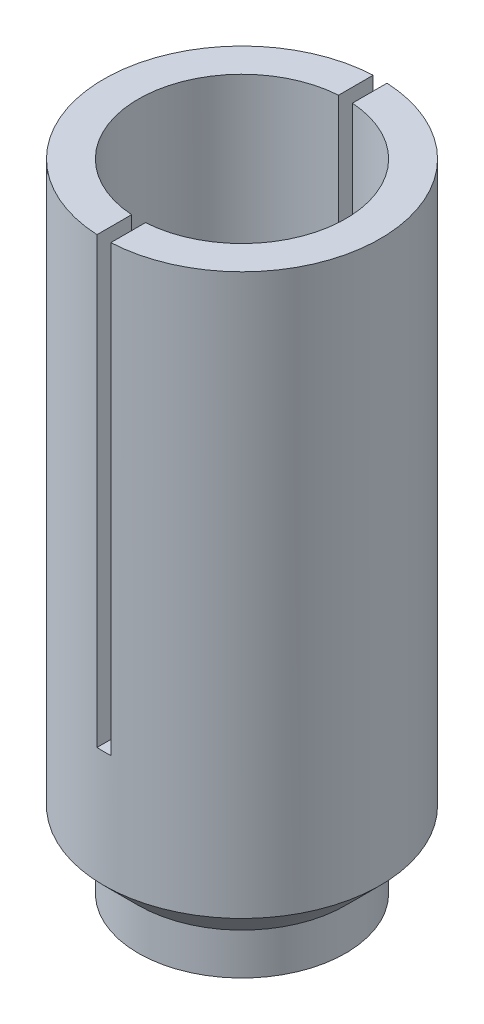
ISO-10303-21;
HEADER;
FILE_DESCRIPTION(('STEP AP214'),'2;1');
FILE_NAME('part.step','',(''),(''),'','','');
FILE_SCHEMA(('AUTOMOTIVE_DESIGN { 1 0 10303 214 1 1 1 1 }'));
ENDSEC;
DATA;
#1=APPLICATION_CONTEXT('core data for automotive mechanical design processes');
#2=APPLICATION_PROTOCOL_DEFINITION('international standard','automotive_design',2000,#1);
#3=PRODUCT_CONTEXT('',#1,'mechanical');
#4=PRODUCT('Part','Part','',(#3));
#5=PRODUCT_RELATED_PRODUCT_CATEGORY('part','',(#4));
#6=PRODUCT_DEFINITION_FORMATION('','',#4);
#7=PRODUCT_DEFINITION_CONTEXT('part definition',#1,'design');
#8=PRODUCT_DEFINITION('design','',#6,#7);
#9=PRODUCT_DEFINITION_SHAPE('','',#8);
#10=(LENGTH_UNIT() NAMED_UNIT(*) SI_UNIT(.MILLI.,.METRE.));
#11=(NAMED_UNIT(*) PLANE_ANGLE_UNIT() SI_UNIT($,.RADIAN.));
#12=(NAMED_UNIT(*) SI_UNIT($,.STERADIAN.) SOLID_ANGLE_UNIT());
#13=UNCERTAINTY_MEASURE_WITH_UNIT(LENGTH_MEASURE(1.E-05),#10,'distance_accuracy_value','');
#14=(GEOMETRIC_REPRESENTATION_CONTEXT(3) GLOBAL_UNCERTAINTY_ASSIGNED_CONTEXT((#13)) GLOBAL_UNIT_ASSIGNED_CONTEXT((#10,
#11,#12)) REPRESENTATION_CONTEXT('',''));
#15=CARTESIAN_POINT('',(0.,0.,0.));
#16=DIRECTION('',(0.,0.,1.));
#17=DIRECTION('',(1.,0.,0.));
#18=AXIS2_PLACEMENT_3D('',#15,#16,#17);
#19=CARTESIAN_POINT('',(0.,23.,0.));
#20=DIRECTION('',(0.,1.,0.));
#21=DIRECTION('',(0.,0.,1.));
#22=AXIS2_PLACEMENT_3D('',#19,#20,#21);
#23=PLANE('',#22);
#24=DIRECTION('',(0.,0.,-1.));
#25=VECTOR('',#24,1.);
#26=CARTESIAN_POINT('',(0.25,23.,0.));
#27=LINE('',#26,#25);
#28=CARTESIAN_POINT('',(0.25,23.,4.99374608885955));
#29=VERTEX_POINT('',#28);
#30=CARTESIAN_POINT('',(0.250000000000002,23.,3.74165738677394));
#31=VERTEX_POINT('',#30);
#32=EDGE_CURVE('E141',#29,#31,#27,.T.);
#33=ORIENTED_EDGE('',*,*,#32,.F.);
#34=CARTESIAN_POINT('',(0.,23.,0.));
#35=DIRECTION('',(0.,1.,0.));
#36=DIRECTION('',(0.,0.,1.));
#37=AXIS2_PLACEMENT_3D('',#34,#35,#36);
#38=CIRCLE('',#37,5.);
#39=CARTESIAN_POINT('',(0.25,23.,-4.99374608885955));
#40=VERTEX_POINT('',#39);
#41=EDGE_CURVE('E164',#29,#40,#38,.T.);
#42=ORIENTED_EDGE('',*,*,#41,.T.);
#43=CARTESIAN_POINT('',(0.250000000000002,23.,-3.74165738677394));
#44=VERTEX_POINT('',#43);
#45=EDGE_CURVE('E145',#44,#40,#27,.T.);
#46=ORIENTED_EDGE('',*,*,#45,.F.);
#47=CARTESIAN_POINT('',(0.,23.,0.));
#48=DIRECTION('',(0.,1.,0.));
#49=DIRECTION('',(0.,0.,1.));
#50=AXIS2_PLACEMENT_3D('',#47,#48,#49);
#51=CIRCLE('',#50,3.75);
#52=EDGE_CURVE('E153',#31,#44,#51,.T.);
#53=ORIENTED_EDGE('',*,*,#52,.F.);
#54=EDGE_LOOP('',(#33,#42,#46,#53));
#55=FACE_BOUND('',#54,.T.);
#56=ADVANCED_FACE('F39',(#55),#23,.T.);
#57=CARTESIAN_POINT('',(0.,23.,0.));
#58=DIRECTION('',(0.,-1.,0.));
#59=DIRECTION('',(0.,0.,-1.));
#60=AXIS2_PLACEMENT_3D('',#57,#58,#59);
#61=CYLINDRICAL_SURFACE('',#60,1.25);
#62=CARTESIAN_POINT('',(0.,3.,0.));
#63=DIRECTION('',(0.,1.,0.));
#64=DIRECTION('',(0.,0.,1.));
#65=AXIS2_PLACEMENT_3D('',#62,#63,#64);
#66=CIRCLE('',#65,1.25);
#67=CARTESIAN_POINT('',(0.,3.,1.25));
#68=VERTEX_POINT('',#67);
#69=EDGE_CURVE('E158',#68,#68,#66,.T.);
#70=ORIENTED_EDGE('',*,*,#69,.F.);
#71=EDGE_LOOP('',(#70));
#72=FACE_BOUND('',#71,.T.);
#73=CARTESIAN_POINT('',(0.,4.,0.));
#74=DIRECTION('',(0.,1.,0.));
#75=DIRECTION('',(0.,0.,1.));
#76=AXIS2_PLACEMENT_3D('',#73,#74,#75);
#77=CIRCLE('',#76,1.25);
#78=CARTESIAN_POINT('',(0.,4.,1.25));
#79=VERTEX_POINT('',#78);
#80=EDGE_CURVE('E157',#79,#79,#77,.T.);
#81=ORIENTED_EDGE('',*,*,#80,.T.);
#82=EDGE_LOOP('',(#81));
#83=FACE_BOUND('',#82,.T.);
#84=ADVANCED_FACE('F252',(#72,#83),#61,.F.);
#85=CARTESIAN_POINT('',(0.,0.,0.));
#86=DIRECTION('',(0.,1.,0.));
#87=DIRECTION('',(0.,0.,1.));
#88=AXIS2_PLACEMENT_3D('',#85,#86,#87);
#89=PLANE('',#88);
#90=CARTESIAN_POINT('',(0.,0.,0.));
#91=DIRECTION('',(0.,1.,0.));
#92=DIRECTION('',(0.,0.,1.));
#93=AXIS2_PLACEMENT_3D('',#90,#91,#92);
#94=CIRCLE('',#93,3.75);
#95=CARTESIAN_POINT('',(0.,0.,3.75));
#96=VERTEX_POINT('',#95);
#97=EDGE_CURVE('E173',#96,#96,#94,.T.);
#98=ORIENTED_EDGE('',*,*,#97,.F.);
#99=EDGE_LOOP('',(#98));
#100=FACE_BOUND('',#99,.T.);
#101=CARTESIAN_POINT('',(0.,0.,0.));
#102=DIRECTION('',(0.,1.,0.));
#103=DIRECTION('',(0.,0.,1.));
#104=AXIS2_PLACEMENT_3D('',#101,#102,#103);
#105=CIRCLE('',#104,2.5);
#106=CARTESIAN_POINT('',(0.,0.,2.5));
#107=VERTEX_POINT('',#106);
#108=EDGE_CURVE('E169',#107,#107,#105,.T.);
#109=ORIENTED_EDGE('',*,*,#108,.T.);
#110=EDGE_LOOP('',(#109));
#111=FACE_BOUND('',#110,.T.);
#112=ADVANCED_FACE('F256',(#100,#111),#89,.F.);
#113=CARTESIAN_POINT('',(0.,3.,0.));
#114=DIRECTION('',(0.,-1.,0.));
#115=DIRECTION('',(0.,0.,-1.));
#116=AXIS2_PLACEMENT_3D('',#113,#114,#115);
#117=CYLINDRICAL_SURFACE('',#116,3.75);
#118=CARTESIAN_POINT('',(0.,1.49999999999999,0.));
#119=DIRECTION('',(0.,1.,0.));
#120=DIRECTION('',(0.,0.,1.));
#121=AXIS2_PLACEMENT_3D('',#118,#119,#120);
#122=CIRCLE('',#121,3.75);
#123=CARTESIAN_POINT('',(0.,1.49999999999999,3.75));
#124=VERTEX_POINT('',#123);
#125=EDGE_CURVE('E177',#124,#124,#122,.F.);
#126=ORIENTED_EDGE('',*,*,#125,.T.);
#127=EDGE_LOOP('',(#126));
#128=FACE_BOUND('',#127,.T.);
#129=ORIENTED_EDGE('',*,*,#97,.T.);
#130=EDGE_LOOP('',(#129));
#131=FACE_BOUND('',#130,.T.);
#132=ADVANCED_FACE('F261',(#128,#131),#117,.T.);
#133=CARTESIAN_POINT('',(0.,3.,0.));
#134=DIRECTION('',(0.,-1.,0.));
#135=DIRECTION('',(0.,0.,-1.));
#136=AXIS2_PLACEMENT_3D('',#133,#134,#135);
#137=CYLINDRICAL_SURFACE('',#136,2.5);
#138=CARTESIAN_POINT('',(0.,3.,0.));
#139=DIRECTION('',(0.,1.,0.));
#140=DIRECTION('',(0.,0.,1.));
#141=AXIS2_PLACEMENT_3D('',#138,#139,#140);
#142=CIRCLE('',#141,2.5);
#143=CARTESIAN_POINT('',(0.,3.,2.5));
#144=VERTEX_POINT('',#143);
#145=EDGE_CURVE('E165',#144,#144,#142,.T.);
#146=ORIENTED_EDGE('',*,*,#145,.T.);
#147=EDGE_LOOP('',(#146));
#148=FACE_BOUND('',#147,.T.);
#149=ORIENTED_EDGE('',*,*,#108,.F.);
#150=EDGE_LOOP('',(#149));
#151=FACE_BOUND('',#150,.T.);
#152=ADVANCED_FACE('F247',(#148,#151),#137,.F.);
#153=CARTESIAN_POINT('',(0.,3.,0.));
#154=DIRECTION('',(0.,1.,0.));
#155=DIRECTION('',(0.,0.,1.));
#156=AXIS2_PLACEMENT_3D('',#153,#154,#155);
#157=PLANE('',#156);
#158=ORIENTED_EDGE('',*,*,#69,.T.);
#159=EDGE_LOOP('',(#158));
#160=FACE_BOUND('',#159,.T.);
#161=ORIENTED_EDGE('',*,*,#145,.F.);
#162=EDGE_LOOP('',(#161));
#163=FACE_BOUND('',#162,.T.);
#164=ADVANCED_FACE('F239',(#160,#163),#157,.F.);
#165=DIRECTION('',(0.,0.,1.));
#166=VECTOR('',#165,1.);
#167=CARTESIAN_POINT('',(-0.25,23.,0.));
#168=LINE('',#167,#166);
#169=CARTESIAN_POINT('',(-0.25,23.,-4.99374608885955));
#170=VERTEX_POINT('',#169);
#171=CARTESIAN_POINT('',(-0.249999999999998,23.,-3.74165738677394));
#172=VERTEX_POINT('',#171);
#173=EDGE_CURVE('E63',#170,#172,#168,.T.);
#174=ORIENTED_EDGE('',*,*,#173,.F.);
#175=CARTESIAN_POINT('',(-0.25,23.,4.99374608885955));
#176=VERTEX_POINT('',#175);
#177=EDGE_CURVE('E131',#170,#176,#38,.T.);
#178=ORIENTED_EDGE('',*,*,#177,.T.);
#179=CARTESIAN_POINT('',(-0.249999999999998,23.,3.74165738677394));
#180=VERTEX_POINT('',#179);
#181=EDGE_CURVE('E133',#180,#176,#168,.T.);
#182=ORIENTED_EDGE('',*,*,#181,.F.);
#183=EDGE_CURVE('E152',#172,#180,#51,.T.);
#184=ORIENTED_EDGE('',*,*,#183,.F.);
#185=EDGE_LOOP('',(#174,#178,#182,#184));
#186=FACE_BOUND('',#185,.T.);
#187=ADVANCED_FACE('F236',(#186),#23,.T.);
#188=CARTESIAN_POINT('',(0.,23.,0.));
#189=DIRECTION('',(0.,-1.,0.));
#190=DIRECTION('',(0.,0.,-1.));
#191=AXIS2_PLACEMENT_3D('',#188,#189,#190);
#192=CYLINDRICAL_SURFACE('',#191,5.);
#193=CARTESIAN_POINT('',(0.,2.74999999999997,0.));
#194=DIRECTION('',(0.,1.,0.));
#195=DIRECTION('',(0.,0.,1.));
#196=AXIS2_PLACEMENT_3D('',#193,#194,#195);
#197=CIRCLE('',#196,5.);
#198=CARTESIAN_POINT('',(0.,2.74999999999997,5.));
#199=VERTEX_POINT('',#198);
#200=EDGE_CURVE('E192',#199,#199,#197,.T.);
#201=ORIENTED_EDGE('',*,*,#200,.T.);
#202=EDGE_LOOP('',(#201));
#203=FACE_BOUND('',#202,.T.);
#204=CARTESIAN_POINT('',(0.,6.94071604862224,0.));
#205=DIRECTION('',(0.,-1.,0.));
#206=DIRECTION('',(0.,0.,-1.));
#207=AXIS2_PLACEMENT_3D('',#204,#205,#206);
#208=CIRCLE('',#207,5.);
#209=CARTESIAN_POINT('',(-0.249999999999998,6.94071604862224,-4.99374608885955));
#210=VERTEX_POINT('',#209);
#211=CARTESIAN_POINT('',(0.250000000000002,6.94071604862224,-4.99374608885955));
#212=VERTEX_POINT('',#211);
#213=EDGE_CURVE('E106',#210,#212,#208,.T.);
#214=ORIENTED_EDGE('',*,*,#213,.T.);
#215=DIRECTION('',(0.,-1.,0.));
#216=VECTOR('',#215,1.);
#217=CARTESIAN_POINT('',(0.25,23.,-4.99374608885955));
#218=LINE('',#217,#216);
#219=EDGE_CURVE('E149',#212,#40,#218,.F.);
#220=ORIENTED_EDGE('',*,*,#219,.T.);
#221=ORIENTED_EDGE('',*,*,#41,.F.);
#222=DIRECTION('',(0.,-1.,0.));
#223=VECTOR('',#222,1.);
#224=CARTESIAN_POINT('',(0.25,23.,4.99374608885955));
#225=LINE('',#224,#223);
#226=CARTESIAN_POINT('',(0.250000000000002,6.94071604862224,4.99374608885955));
#227=VERTEX_POINT('',#226);
#228=EDGE_CURVE('E144',#29,#227,#225,.T.);
#229=ORIENTED_EDGE('',*,*,#228,.T.);
#230=CARTESIAN_POINT('',(-0.249999999999998,6.94071604862224,4.99374608885955));
#231=VERTEX_POINT('',#230);
#232=EDGE_CURVE('E118',#227,#231,#208,.T.);
#233=ORIENTED_EDGE('',*,*,#232,.T.);
#234=DIRECTION('',(0.,-1.,0.));
#235=VECTOR('',#234,1.);
#236=CARTESIAN_POINT('',(-0.25,23.,4.99374608885955));
#237=LINE('',#236,#235);
#238=EDGE_CURVE('E119',#231,#176,#237,.F.);
#239=ORIENTED_EDGE('',*,*,#238,.T.);
#240=ORIENTED_EDGE('',*,*,#177,.F.);
#241=DIRECTION('',(0.,-1.,0.));
#242=VECTOR('',#241,1.);
#243=CARTESIAN_POINT('',(-0.25,23.,-4.99374608885955));
#244=LINE('',#243,#242);
#245=EDGE_CURVE('E122',#170,#210,#244,.T.);
#246=ORIENTED_EDGE('',*,*,#245,.T.);
#247=EDGE_LOOP('',(#214,#220,#221,#229,#233,#239,#240,#246));
#248=FACE_BOUND('',#247,.T.);
#249=ADVANCED_FACE('F128',(#203,#248),#192,.T.);
#250=CARTESIAN_POINT('',(0.,4.,0.));
#251=DIRECTION('',(0.,1.,0.));
#252=DIRECTION('',(0.,0.,1.));
#253=AXIS2_PLACEMENT_3D('',#250,#251,#252);
#254=CYLINDRICAL_SURFACE('',#253,3.75);
#255=CARTESIAN_POINT('',(0.,5.49999999999999,0.));
#256=DIRECTION('',(0.,1.,0.));
#257=DIRECTION('',(0.,0.,1.));
#258=AXIS2_PLACEMENT_3D('',#255,#256,#257);
#259=CIRCLE('',#258,3.75);
#260=CARTESIAN_POINT('',(0.,5.49999999999999,3.75));
#261=VERTEX_POINT('',#260);
#262=EDGE_CURVE('E188',#261,#261,#259,.F.);
#263=ORIENTED_EDGE('',*,*,#262,.T.);
#264=EDGE_LOOP('',(#263));
#265=FACE_BOUND('',#264,.T.);
#266=CARTESIAN_POINT('',(0.,6.94071604862224,0.));
#267=DIRECTION('',(0.,-1.,0.));
#268=DIRECTION('',(0.,0.,-1.));
#269=AXIS2_PLACEMENT_3D('',#266,#267,#268);
#270=CIRCLE('',#269,3.75);
#271=CARTESIAN_POINT('',(-0.249999999999998,6.94071604862224,3.74165738677394));
#272=VERTEX_POINT('',#271);
#273=CARTESIAN_POINT('',(0.250000000000002,6.94071604862224,3.74165738677394));
#274=VERTEX_POINT('',#273);
#275=EDGE_CURVE('E48',#272,#274,#270,.F.);
#276=ORIENTED_EDGE('',*,*,#275,.T.);
#277=DIRECTION('',(0.,1.,0.));
#278=VECTOR('',#277,1.);
#279=CARTESIAN_POINT('',(0.250000000000002,4.,3.74165738677394));
#280=LINE('',#279,#278);
#281=EDGE_CURVE('E11',#274,#31,#280,.T.);
#282=ORIENTED_EDGE('',*,*,#281,.T.);
#283=ORIENTED_EDGE('',*,*,#52,.T.);
#284=DIRECTION('',(0.,1.,0.));
#285=VECTOR('',#284,1.);
#286=CARTESIAN_POINT('',(0.250000000000002,4.,-3.74165738677394));
#287=LINE('',#286,#285);
#288=CARTESIAN_POINT('',(0.250000000000002,6.94071604862224,-3.74165738677394));
#289=VERTEX_POINT('',#288);
#290=EDGE_CURVE('E201',#44,#289,#287,.F.);
#291=ORIENTED_EDGE('',*,*,#290,.T.);
#292=CARTESIAN_POINT('',(-0.249999999999998,6.94071604862224,-3.74165738677394));
#293=VERTEX_POINT('',#292);
#294=EDGE_CURVE('E198',#289,#293,#270,.F.);
#295=ORIENTED_EDGE('',*,*,#294,.T.);
#296=DIRECTION('',(0.,1.,0.));
#297=VECTOR('',#296,1.);
#298=CARTESIAN_POINT('',(-0.249999999999998,4.,-3.74165738677394));
#299=LINE('',#298,#297);
#300=EDGE_CURVE('E123',#293,#172,#299,.T.);
#301=ORIENTED_EDGE('',*,*,#300,.T.);
#302=ORIENTED_EDGE('',*,*,#183,.T.);
#303=DIRECTION('',(0.,1.,0.));
#304=VECTOR('',#303,1.);
#305=CARTESIAN_POINT('',(-0.249999999999998,4.,3.74165738677394));
#306=LINE('',#305,#304);
#307=EDGE_CURVE('E204',#180,#272,#306,.F.);
#308=ORIENTED_EDGE('',*,*,#307,.T.);
#309=EDGE_LOOP('',(#276,#282,#283,#291,#295,#301,#302,#308));
#310=FACE_BOUND('',#309,.T.);
#311=ADVANCED_FACE('F211',(#265,#310),#254,.F.);
#312=CARTESIAN_POINT('',(0.,4.,0.));
#313=DIRECTION('',(0.,1.,0.));
#314=DIRECTION('',(0.,0.,1.));
#315=AXIS2_PLACEMENT_3D('',#312,#313,#314);
#316=PLANE('',#315);
#317=CARTESIAN_POINT('',(0.,4.,0.));
#318=DIRECTION('',(0.,1.,0.));
#319=DIRECTION('',(0.,0.,1.));
#320=AXIS2_PLACEMENT_3D('',#317,#318,#319);
#321=CIRCLE('',#320,2.25);
#322=CARTESIAN_POINT('',(0.,4.,2.25));
#323=VERTEX_POINT('',#322);
#324=EDGE_CURVE('E184',#323,#323,#321,.T.);
#325=ORIENTED_EDGE('',*,*,#324,.T.);
#326=EDGE_LOOP('',(#325));
#327=FACE_BOUND('',#326,.T.);
#328=ORIENTED_EDGE('',*,*,#80,.F.);
#329=EDGE_LOOP('',(#328));
#330=FACE_BOUND('',#329,.T.);
#331=ADVANCED_FACE('F269',(#327,#330),#316,.T.);
#332=CARTESIAN_POINT('',(0.,3.,0.));
#333=DIRECTION('',(0.,1.,0.));
#334=DIRECTION('',(0.,0.,1.));
#335=AXIS2_PLACEMENT_3D('',#332,#333,#334);
#336=CONICAL_SURFACE('',#335,5.25000000000003,0.785398163397453);
#337=ORIENTED_EDGE('',*,*,#125,.F.);
#338=EDGE_LOOP('',(#337));
#339=FACE_BOUND('',#338,.T.);
#340=ORIENTED_EDGE('',*,*,#200,.F.);
#341=EDGE_LOOP('',(#340));
#342=FACE_BOUND('',#341,.T.);
#343=ADVANCED_FACE('F273',(#339,#342),#336,.T.);
#344=CARTESIAN_POINT('',(0.,4.,0.));
#345=DIRECTION('',(0.,1.,0.));
#346=DIRECTION('',(0.,0.,1.));
#347=AXIS2_PLACEMENT_3D('',#344,#345,#346);
#348=CONICAL_SURFACE('',#347,2.25,0.785398163397453);
#349=ORIENTED_EDGE('',*,*,#262,.F.);
#350=EDGE_LOOP('',(#349));
#351=FACE_BOUND('',#350,.T.);
#352=ORIENTED_EDGE('',*,*,#324,.F.);
#353=EDGE_LOOP('',(#352));
#354=FACE_BOUND('',#353,.T.);
#355=ADVANCED_FACE('F41',(#351,#354),#348,.F.);
#356=CARTESIAN_POINT('',(-0.250000000000002,39.0592839513778,-5.));
#357=DIRECTION('',(-1.,0.,0.));
#358=DIRECTION('',(0.,-1.,0.));
#359=AXIS2_PLACEMENT_3D('',#356,#357,#358);
#360=PLANE('',#359);
#361=ORIENTED_EDGE('',*,*,#173,.T.);
#362=ORIENTED_EDGE('',*,*,#300,.F.);
#363=DIRECTION('',(0.,0.,1.));
#364=VECTOR('',#363,1.);
#365=CARTESIAN_POINT('',(-0.249999999999998,6.94071604862224,-5.));
#366=LINE('',#365,#364);
#367=EDGE_CURVE('E109',#210,#293,#366,.T.);
#368=ORIENTED_EDGE('',*,*,#367,.F.);
#369=ORIENTED_EDGE('',*,*,#245,.F.);
#370=EDGE_LOOP('',(#361,#362,#368,#369));
#371=FACE_BOUND('',#370,.T.);
#372=ADVANCED_FACE('F121',(#371),#360,.F.);
#373=CARTESIAN_POINT('',(-0.249999999999998,6.94071604862224,-5.));
#374=DIRECTION('',(0.,-1.,0.));
#375=DIRECTION('',(0.,0.,-1.));
#376=AXIS2_PLACEMENT_3D('',#373,#374,#375);
#377=PLANE('',#376);
#378=ORIENTED_EDGE('',*,*,#213,.F.);
#379=ORIENTED_EDGE('',*,*,#367,.T.);
#380=ORIENTED_EDGE('',*,*,#294,.F.);
#381=DIRECTION('',(0.,0.,1.));
#382=VECTOR('',#381,1.);
#383=CARTESIAN_POINT('',(0.250000000000002,6.94071604862224,-5.));
#384=LINE('',#383,#382);
#385=EDGE_CURVE('E112',#212,#289,#384,.T.);
#386=ORIENTED_EDGE('',*,*,#385,.F.);
#387=EDGE_LOOP('',(#378,#379,#380,#386));
#388=FACE_BOUND('',#387,.T.);
#389=ADVANCED_FACE('F108',(#388),#377,.F.);
#390=CARTESIAN_POINT('',(0.249999999999998,39.0592839513778,-5.));
#391=DIRECTION('',(1.,0.,0.));
#392=DIRECTION('',(0.,1.,0.));
#393=AXIS2_PLACEMENT_3D('',#390,#391,#392);
#394=PLANE('',#393);
#395=ORIENTED_EDGE('',*,*,#385,.T.);
#396=ORIENTED_EDGE('',*,*,#290,.F.);
#397=ORIENTED_EDGE('',*,*,#45,.T.);
#398=ORIENTED_EDGE('',*,*,#219,.F.);
#399=EDGE_LOOP('',(#395,#396,#397,#398));
#400=FACE_BOUND('',#399,.T.);
#401=ADVANCED_FACE('F223',(#400),#394,.F.);
#402=ORIENTED_EDGE('',*,*,#32,.T.);
#403=ORIENTED_EDGE('',*,*,#281,.F.);
#404=EDGE_CURVE('E125',#274,#227,#384,.T.);
#405=ORIENTED_EDGE('',*,*,#404,.T.);
#406=ORIENTED_EDGE('',*,*,#228,.F.);
#407=EDGE_LOOP('',(#402,#403,#405,#406));
#408=FACE_BOUND('',#407,.T.);
#409=ADVANCED_FACE('F277',(#408),#394,.F.);
#410=ORIENTED_EDGE('',*,*,#404,.F.);
#411=ORIENTED_EDGE('',*,*,#275,.F.);
#412=EDGE_CURVE('E55',#272,#231,#366,.T.);
#413=ORIENTED_EDGE('',*,*,#412,.T.);
#414=ORIENTED_EDGE('',*,*,#232,.F.);
#415=EDGE_LOOP('',(#410,#411,#413,#414));
#416=FACE_BOUND('',#415,.T.);
#417=ADVANCED_FACE('F215',(#416),#377,.F.);
#418=ORIENTED_EDGE('',*,*,#412,.F.);
#419=ORIENTED_EDGE('',*,*,#307,.F.);
#420=ORIENTED_EDGE('',*,*,#181,.T.);
#421=ORIENTED_EDGE('',*,*,#238,.F.);
#422=EDGE_LOOP('',(#418,#419,#420,#421));
#423=FACE_BOUND('',#422,.T.);
#424=ADVANCED_FACE('F232',(#423),#360,.F.);
#425=CLOSED_SHELL('',(#56,#84,#112,#132,#152,#164,#187,#249,#311,#331,#343,#355,#372,#389,#401,
#409,#417,#424));
#426=MANIFOLD_SOLID_BREP('B2',#425);
#427=ADVANCED_BREP_SHAPE_REPRESENTATION('',(#18,#426),#14);
#428=SHAPE_DEFINITION_REPRESENTATION(#9,#427);
ENDSEC;
END-ISO-10303-21;
